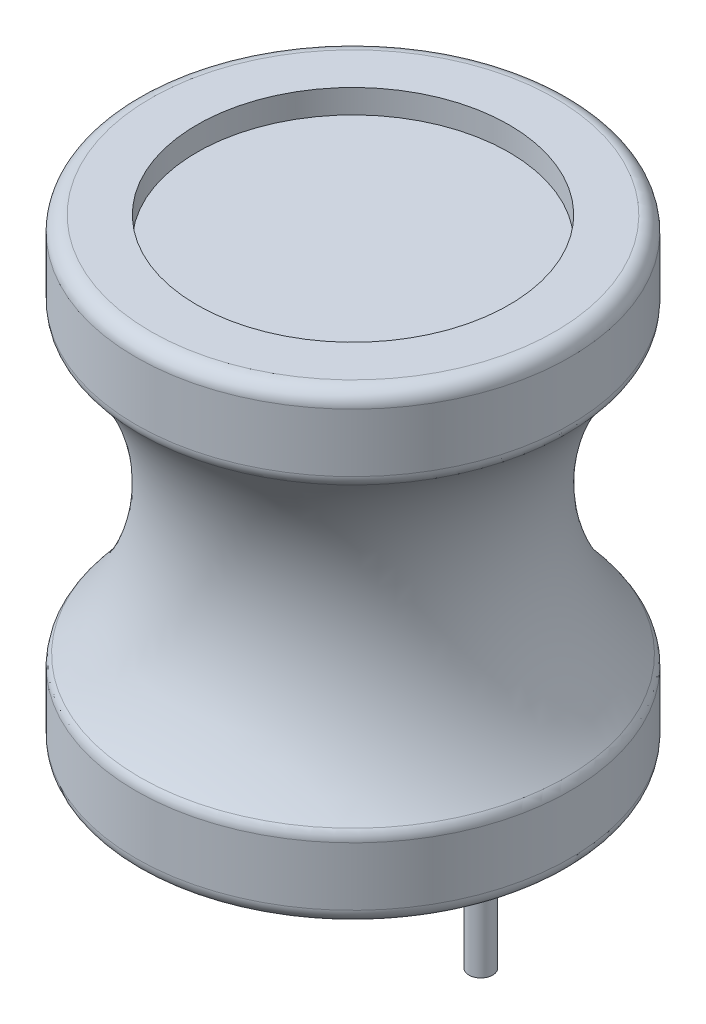
ISO-10303-21;
HEADER;
FILE_DESCRIPTION(('STEP AP214'),'2;1');
FILE_NAME('part.step','',(''),(''),'','','');
FILE_SCHEMA(('AUTOMOTIVE_DESIGN { 1 0 10303 214 1 1 1 1 }'));
ENDSEC;
DATA;
#1=APPLICATION_CONTEXT('core data for automotive mechanical design processes');
#2=APPLICATION_PROTOCOL_DEFINITION('international standard','automotive_design',2000,#1);
#3=PRODUCT_CONTEXT('',#1,'mechanical');
#4=PRODUCT('Part','Part','',(#3));
#5=PRODUCT_RELATED_PRODUCT_CATEGORY('part','',(#4));
#6=PRODUCT_DEFINITION_FORMATION('','',#4);
#7=PRODUCT_DEFINITION_CONTEXT('part definition',#1,'design');
#8=PRODUCT_DEFINITION('design','',#6,#7);
#9=PRODUCT_DEFINITION_SHAPE('','',#8);
#10=(LENGTH_UNIT() NAMED_UNIT(*) SI_UNIT(.MILLI.,.METRE.));
#11=(NAMED_UNIT(*) PLANE_ANGLE_UNIT() SI_UNIT($,.RADIAN.));
#12=(NAMED_UNIT(*) SI_UNIT($,.STERADIAN.) SOLID_ANGLE_UNIT());
#13=UNCERTAINTY_MEASURE_WITH_UNIT(LENGTH_MEASURE(1.E-05),#10,'distance_accuracy_value','');
#14=(GEOMETRIC_REPRESENTATION_CONTEXT(3) GLOBAL_UNCERTAINTY_ASSIGNED_CONTEXT((#13)) GLOBAL_UNIT_ASSIGNED_CONTEXT((#10,
#11,#12)) REPRESENTATION_CONTEXT('',''));
#15=CARTESIAN_POINT('',(0.,0.,0.));
#16=DIRECTION('',(0.,0.,1.));
#17=DIRECTION('',(1.,0.,0.));
#18=AXIS2_PLACEMENT_3D('',#15,#16,#17);
#19=CARTESIAN_POINT('',(0.,7.3,0.));
#20=DIRECTION('',(0.,1.,0.));
#21=DIRECTION('',(0.,0.,1.));
#22=AXIS2_PLACEMENT_3D('',#19,#20,#21);
#23=TOROIDAL_SURFACE('',#22,6.8,0.5);
#24=CARTESIAN_POINT('',(0.,7.3,0.));
#25=DIRECTION('',(0.,1.,0.));
#26=DIRECTION('',(0.,0.,1.));
#27=AXIS2_PLACEMENT_3D('',#24,#25,#26);
#28=CIRCLE('',#27,7.3);
#29=CARTESIAN_POINT('',(0.,7.3,7.3));
#30=VERTEX_POINT('',#29);
#31=EDGE_CURVE('E10',#30,#30,#28,.T.);
#32=ORIENTED_EDGE('',*,*,#31,.T.);
#33=EDGE_LOOP('',(#32));
#34=FACE_BOUND('',#33,.T.);
#35=CARTESIAN_POINT('',(0.,7.8,0.));
#36=DIRECTION('',(0.,1.,0.));
#37=DIRECTION('',(0.,0.,1.));
#38=AXIS2_PLACEMENT_3D('',#35,#36,#37);
#39=CIRCLE('',#38,6.8);
#40=CARTESIAN_POINT('',(0.,7.8,6.8));
#41=VERTEX_POINT('',#40);
#42=EDGE_CURVE('E89',#41,#41,#39,.T.);
#43=ORIENTED_EDGE('',*,*,#42,.F.);
#44=EDGE_LOOP('',(#43));
#45=FACE_BOUND('',#44,.T.);
#46=ADVANCED_FACE('F36',(#34,#45),#23,.T.);
#47=CARTESIAN_POINT('',(0.,12.5652577925041,0.));
#48=DIRECTION('',(0.,1.,0.));
#49=DIRECTION('',(0.,0.,1.));
#50=AXIS2_PLACEMENT_3D('',#47,#48,#49);
#51=CYLINDRICAL_SURFACE('',#50,7.3);
#52=CARTESIAN_POINT('',(0.,5.33482645950291,0.));
#53=DIRECTION('',(0.,1.,0.));
#54=DIRECTION('',(0.,0.,1.));
#55=AXIS2_PLACEMENT_3D('',#52,#53,#54);
#56=CIRCLE('',#55,7.3);
#57=CARTESIAN_POINT('',(0.,5.33482645950291,7.3));
#58=VERTEX_POINT('',#57);
#59=EDGE_CURVE('E43',#58,#58,#56,.T.);
#60=ORIENTED_EDGE('',*,*,#59,.T.);
#61=EDGE_LOOP('',(#60));
#62=FACE_BOUND('',#61,.T.);
#63=ORIENTED_EDGE('',*,*,#31,.F.);
#64=EDGE_LOOP('',(#63));
#65=FACE_BOUND('',#64,.T.);
#66=ADVANCED_FACE('F165',(#62,#65),#51,.T.);
#67=CARTESIAN_POINT('',(0.,5.33482645950291,0.));
#68=DIRECTION('',(0.,1.,0.));
#69=DIRECTION('',(0.,0.,1.));
#70=AXIS2_PLACEMENT_3D('',#67,#68,#69);
#71=TOROIDAL_SURFACE('',#70,6.8,0.5);
#72=CARTESIAN_POINT('',(0.,5.,0.));
#73=DIRECTION('',(0.,1.,0.));
#74=DIRECTION('',(0.,0.,1.));
#75=AXIS2_PLACEMENT_3D('',#72,#73,#74);
#76=CIRCLE('',#75,7.17133710024282);
#77=CARTESIAN_POINT('',(0.,5.,7.17133710024282));
#78=VERTEX_POINT('',#77);
#79=EDGE_CURVE('E50',#78,#78,#76,.T.);
#80=ORIENTED_EDGE('',*,*,#79,.T.);
#81=EDGE_LOOP('',(#80));
#82=FACE_BOUND('',#81,.T.);
#83=ORIENTED_EDGE('',*,*,#59,.F.);
#84=EDGE_LOOP('',(#83));
#85=FACE_BOUND('',#84,.T.);
#86=ADVANCED_FACE('F159',(#82,#85),#71,.T.);
#87=CARTESIAN_POINT('',(0.,0.,0.));
#88=DIRECTION('',(0.,1.,0.));
#89=DIRECTION('',(0.,0.,1.));
#90=AXIS2_PLACEMENT_3D('',#87,#88,#89);
#91=TOROIDAL_SURFACE('',#90,12.7165544763445,7.46655447634447);
#92=CARTESIAN_POINT('',(0.,-5.,0.));
#93=DIRECTION('',(0.,1.,0.));
#94=DIRECTION('',(0.,0.,1.));
#95=AXIS2_PLACEMENT_3D('',#92,#93,#94);
#96=CIRCLE('',#95,7.17133710024282);
#97=CARTESIAN_POINT('',(0.,-5.,7.17133710024282));
#98=VERTEX_POINT('',#97);
#99=EDGE_CURVE('E56',#98,#98,#96,.T.);
#100=ORIENTED_EDGE('',*,*,#99,.T.);
#101=EDGE_LOOP('',(#100));
#102=FACE_BOUND('',#101,.T.);
#103=ORIENTED_EDGE('',*,*,#79,.F.);
#104=EDGE_LOOP('',(#103));
#105=FACE_BOUND('',#104,.T.);
#106=ADVANCED_FACE('F153',(#102,#105),#91,.F.);
#107=CARTESIAN_POINT('',(0.,-5.33482645950291,0.));
#108=DIRECTION('',(0.,1.,0.));
#109=DIRECTION('',(0.,0.,1.));
#110=AXIS2_PLACEMENT_3D('',#107,#108,#109);
#111=TOROIDAL_SURFACE('',#110,6.8,0.5);
#112=CARTESIAN_POINT('',(0.,-5.33482645950291,0.));
#113=DIRECTION('',(0.,1.,0.));
#114=DIRECTION('',(0.,0.,1.));
#115=AXIS2_PLACEMENT_3D('',#112,#113,#114);
#116=CIRCLE('',#115,7.3);
#117=CARTESIAN_POINT('',(0.,-5.33482645950291,7.3));
#118=VERTEX_POINT('',#117);
#119=EDGE_CURVE('E62',#118,#118,#116,.T.);
#120=ORIENTED_EDGE('',*,*,#119,.T.);
#121=EDGE_LOOP('',(#120));
#122=FACE_BOUND('',#121,.T.);
#123=ORIENTED_EDGE('',*,*,#99,.F.);
#124=EDGE_LOOP('',(#123));
#125=FACE_BOUND('',#124,.T.);
#126=ADVANCED_FACE('F147',(#122,#125),#111,.T.);
#127=CARTESIAN_POINT('',(0.,12.5652577925041,0.));
#128=DIRECTION('',(0.,1.,0.));
#129=DIRECTION('',(0.,0.,1.));
#130=AXIS2_PLACEMENT_3D('',#127,#128,#129);
#131=CYLINDRICAL_SURFACE('',#130,7.3);
#132=CARTESIAN_POINT('',(0.,-7.3,0.));
#133=DIRECTION('',(0.,1.,0.));
#134=DIRECTION('',(0.,0.,1.));
#135=AXIS2_PLACEMENT_3D('',#132,#133,#134);
#136=CIRCLE('',#135,7.3);
#137=CARTESIAN_POINT('',(0.,-7.3,7.3));
#138=VERTEX_POINT('',#137);
#139=EDGE_CURVE('E66',#138,#138,#136,.T.);
#140=ORIENTED_EDGE('',*,*,#139,.T.);
#141=EDGE_LOOP('',(#140));
#142=FACE_BOUND('',#141,.T.);
#143=ORIENTED_EDGE('',*,*,#119,.F.);
#144=EDGE_LOOP('',(#143));
#145=FACE_BOUND('',#144,.T.);
#146=ADVANCED_FACE('F141',(#142,#145),#131,.T.);
#147=CARTESIAN_POINT('',(0.,-7.3,0.));
#148=DIRECTION('',(0.,1.,0.));
#149=DIRECTION('',(0.,0.,1.));
#150=AXIS2_PLACEMENT_3D('',#147,#148,#149);
#151=TOROIDAL_SURFACE('',#150,6.8,0.5);
#152=CARTESIAN_POINT('',(0.,-7.8,0.));
#153=DIRECTION('',(0.,1.,0.));
#154=DIRECTION('',(0.,0.,1.));
#155=AXIS2_PLACEMENT_3D('',#152,#153,#154);
#156=CIRCLE('',#155,6.8);
#157=CARTESIAN_POINT('',(0.,-7.8,6.8));
#158=VERTEX_POINT('',#157);
#159=EDGE_CURVE('E70',#158,#158,#156,.T.);
#160=ORIENTED_EDGE('',*,*,#159,.T.);
#161=EDGE_LOOP('',(#160));
#162=FACE_BOUND('',#161,.T.);
#163=ORIENTED_EDGE('',*,*,#139,.F.);
#164=EDGE_LOOP('',(#163));
#165=FACE_BOUND('',#164,.T.);
#166=ADVANCED_FACE('F135',(#162,#165),#151,.T.);
#167=CARTESIAN_POINT('',(0.,-7.8,6.8));
#168=DIRECTION('',(0.,-1.,0.));
#169=DIRECTION('',(0.,0.,-1.));
#170=AXIS2_PLACEMENT_3D('',#167,#168,#169);
#171=PLANE('',#170);
#172=CARTESIAN_POINT('',(0.,-7.8,0.));
#173=DIRECTION('',(0.,1.,0.));
#174=DIRECTION('',(0.,0.,1.));
#175=AXIS2_PLACEMENT_3D('',#172,#173,#174);
#176=CIRCLE('',#175,5.25);
#177=CARTESIAN_POINT('',(0.,-7.8,5.25));
#178=VERTEX_POINT('',#177);
#179=EDGE_CURVE('E74',#178,#178,#176,.T.);
#180=ORIENTED_EDGE('',*,*,#179,.T.);
#181=EDGE_LOOP('',(#180));
#182=FACE_BOUND('',#181,.T.);
#183=ORIENTED_EDGE('',*,*,#159,.F.);
#184=EDGE_LOOP('',(#183));
#185=FACE_BOUND('',#184,.T.);
#186=ADVANCED_FACE('F129',(#182,#185),#171,.T.);
#187=CARTESIAN_POINT('',(0.,12.5652577925041,0.));
#188=DIRECTION('',(0.,1.,0.));
#189=DIRECTION('',(0.,0.,1.));
#190=AXIS2_PLACEMENT_3D('',#187,#188,#189);
#191=CYLINDRICAL_SURFACE('',#190,5.25);
#192=CARTESIAN_POINT('',(0.,-7.,0.));
#193=DIRECTION('',(0.,1.,0.));
#194=DIRECTION('',(0.,0.,1.));
#195=AXIS2_PLACEMENT_3D('',#192,#193,#194);
#196=CIRCLE('',#195,5.25);
#197=CARTESIAN_POINT('',(0.,-7.,5.25));
#198=VERTEX_POINT('',#197);
#199=EDGE_CURVE('E78',#198,#198,#196,.T.);
#200=ORIENTED_EDGE('',*,*,#199,.T.);
#201=EDGE_LOOP('',(#200));
#202=FACE_BOUND('',#201,.T.);
#203=ORIENTED_EDGE('',*,*,#179,.F.);
#204=EDGE_LOOP('',(#203));
#205=FACE_BOUND('',#204,.T.);
#206=ADVANCED_FACE('F121',(#202,#205),#191,.F.);
#207=CARTESIAN_POINT('',(0.,-7.,5.25));
#208=DIRECTION('',(0.,-1.,0.));
#209=DIRECTION('',(0.,0.,-1.));
#210=AXIS2_PLACEMENT_3D('',#207,#208,#209);
#211=PLANE('',#210);
#212=CARTESIAN_POINT('',(4.3,-7.,0.));
#213=DIRECTION('',(0.,-1.,0.));
#214=DIRECTION('',(0.,0.,1.));
#215=AXIS2_PLACEMENT_3D('',#212,#213,#214);
#216=CIRCLE('',#215,0.4);
#217=CARTESIAN_POINT('',(4.3,-7.,0.400000000000002));
#218=VERTEX_POINT('',#217);
#219=EDGE_CURVE('E101',#218,#218,#216,.T.);
#220=ORIENTED_EDGE('',*,*,#219,.F.);
#221=EDGE_LOOP('',(#220));
#222=FACE_BOUND('',#221,.T.);
#223=CARTESIAN_POINT('',(-4.3,-7.,0.));
#224=DIRECTION('',(0.,-1.,0.));
#225=DIRECTION('',(0.,0.,-1.));
#226=AXIS2_PLACEMENT_3D('',#223,#224,#225);
#227=CIRCLE('',#226,0.4);
#228=CARTESIAN_POINT('',(-4.3,-7.,-0.4));
#229=VERTEX_POINT('',#228);
#230=EDGE_CURVE('E93',#229,#229,#227,.T.);
#231=ORIENTED_EDGE('',*,*,#230,.F.);
#232=EDGE_LOOP('',(#231));
#233=FACE_BOUND('',#232,.T.);
#234=ORIENTED_EDGE('',*,*,#199,.F.);
#235=EDGE_LOOP('',(#234));
#236=FACE_BOUND('',#235,.T.);
#237=ADVANCED_FACE('F117',(#222,#233,#236),#211,.T.);
#238=CARTESIAN_POINT('',(0.,7.,5.25));
#239=DIRECTION('',(0.,1.,0.));
#240=DIRECTION('',(0.,0.,1.));
#241=AXIS2_PLACEMENT_3D('',#238,#239,#240);
#242=PLANE('',#241);
#243=CARTESIAN_POINT('',(0.,7.,0.));
#244=DIRECTION('',(0.,1.,0.));
#245=DIRECTION('',(0.,0.,1.));
#246=AXIS2_PLACEMENT_3D('',#243,#244,#245);
#247=CIRCLE('',#246,5.25);
#248=CARTESIAN_POINT('',(0.,7.,5.25));
#249=VERTEX_POINT('',#248);
#250=EDGE_CURVE('E82',#249,#249,#247,.T.);
#251=ORIENTED_EDGE('',*,*,#250,.T.);
#252=EDGE_LOOP('',(#251));
#253=FACE_BOUND('',#252,.T.);
#254=ADVANCED_FACE('F120',(#253),#242,.T.);
#255=CARTESIAN_POINT('',(0.,12.5652577925041,0.));
#256=DIRECTION('',(0.,1.,0.));
#257=DIRECTION('',(0.,0.,1.));
#258=AXIS2_PLACEMENT_3D('',#255,#256,#257);
#259=CYLINDRICAL_SURFACE('',#258,5.25);
#260=CARTESIAN_POINT('',(0.,7.8,0.));
#261=DIRECTION('',(0.,1.,0.));
#262=DIRECTION('',(0.,0.,1.));
#263=AXIS2_PLACEMENT_3D('',#260,#261,#262);
#264=CIRCLE('',#263,5.25);
#265=CARTESIAN_POINT('',(0.,7.8,5.25));
#266=VERTEX_POINT('',#265);
#267=EDGE_CURVE('E85',#266,#266,#264,.T.);
#268=ORIENTED_EDGE('',*,*,#267,.T.);
#269=EDGE_LOOP('',(#268));
#270=FACE_BOUND('',#269,.T.);
#271=ORIENTED_EDGE('',*,*,#250,.F.);
#272=EDGE_LOOP('',(#271));
#273=FACE_BOUND('',#272,.T.);
#274=ADVANCED_FACE('F180',(#270,#273),#259,.F.);
#275=CARTESIAN_POINT('',(0.,7.8,6.8));
#276=DIRECTION('',(0.,1.,0.));
#277=DIRECTION('',(0.,0.,1.));
#278=AXIS2_PLACEMENT_3D('',#275,#276,#277);
#279=PLANE('',#278);
#280=ORIENTED_EDGE('',*,*,#42,.T.);
#281=EDGE_LOOP('',(#280));
#282=FACE_BOUND('',#281,.T.);
#283=ORIENTED_EDGE('',*,*,#267,.F.);
#284=EDGE_LOOP('',(#283));
#285=FACE_BOUND('',#284,.T.);
#286=ADVANCED_FACE('F176',(#282,#285),#279,.T.);
#287=CARTESIAN_POINT('',(-4.3,-12.,0.));
#288=DIRECTION('',(0.,1.,0.));
#289=DIRECTION('',(0.,0.,1.));
#290=AXIS2_PLACEMENT_3D('',#287,#288,#289);
#291=CYLINDRICAL_SURFACE('',#290,0.4);
#292=CARTESIAN_POINT('',(-4.3,-12.,0.));
#293=DIRECTION('',(0.,-1.,0.));
#294=DIRECTION('',(0.,0.,-1.));
#295=AXIS2_PLACEMENT_3D('',#292,#293,#294);
#296=CIRCLE('',#295,0.4);
#297=CARTESIAN_POINT('',(-4.3,-12.,-0.4));
#298=VERTEX_POINT('',#297);
#299=EDGE_CURVE('E92',#298,#298,#296,.T.);
#300=ORIENTED_EDGE('',*,*,#299,.F.);
#301=EDGE_LOOP('',(#300));
#302=FACE_BOUND('',#301,.T.);
#303=ORIENTED_EDGE('',*,*,#230,.T.);
#304=EDGE_LOOP('',(#303));
#305=FACE_BOUND('',#304,.T.);
#306=ADVANCED_FACE('F179',(#302,#305),#291,.T.);
#307=CARTESIAN_POINT('',(-4.3,-12.,0.));
#308=DIRECTION('',(0.,-1.,0.));
#309=DIRECTION('',(0.,0.,-1.));
#310=AXIS2_PLACEMENT_3D('',#307,#308,#309);
#311=PLANE('',#310);
#312=ORIENTED_EDGE('',*,*,#299,.T.);
#313=EDGE_LOOP('',(#312));
#314=FACE_BOUND('',#313,.T.);
#315=ADVANCED_FACE('F113',(#314),#311,.T.);
#316=CARTESIAN_POINT('',(4.3,-12.,0.));
#317=DIRECTION('',(0.,1.,0.));
#318=DIRECTION('',(0.,0.,1.));
#319=AXIS2_PLACEMENT_3D('',#316,#317,#318);
#320=CYLINDRICAL_SURFACE('',#319,0.4);
#321=CARTESIAN_POINT('',(4.3,-12.,0.));
#322=DIRECTION('',(0.,-1.,0.));
#323=DIRECTION('',(0.,0.,1.));
#324=AXIS2_PLACEMENT_3D('',#321,#322,#323);
#325=CIRCLE('',#324,0.4);
#326=CARTESIAN_POINT('',(4.3,-12.,0.400000000000002));
#327=VERTEX_POINT('',#326);
#328=EDGE_CURVE('E97',#327,#327,#325,.T.);
#329=ORIENTED_EDGE('',*,*,#328,.F.);
#330=EDGE_LOOP('',(#329));
#331=FACE_BOUND('',#330,.T.);
#332=ORIENTED_EDGE('',*,*,#219,.T.);
#333=EDGE_LOOP('',(#332));
#334=FACE_BOUND('',#333,.T.);
#335=ADVANCED_FACE('F110',(#331,#334),#320,.T.);
#336=CARTESIAN_POINT('',(4.3,-12.,0.));
#337=DIRECTION('',(0.,1.,0.));
#338=DIRECTION('',(0.,0.,1.));
#339=AXIS2_PLACEMENT_3D('',#336,#337,#338);
#340=PLANE('',#339);
#341=ORIENTED_EDGE('',*,*,#328,.T.);
#342=EDGE_LOOP('',(#341));
#343=FACE_BOUND('',#342,.T.);
#344=ADVANCED_FACE('F108',(#343),#340,.F.);
#345=CLOSED_SHELL('',(#46,#66,#86,#106,#126,#146,#166,#186,#206,#237,#254,#274,#286,#306,#315,
#335,#344));
#346=MANIFOLD_SOLID_BREP('B2',#345);
#347=ADVANCED_BREP_SHAPE_REPRESENTATION('',(#18,#346),#14);
#348=SHAPE_DEFINITION_REPRESENTATION(#9,#347);
ENDSEC;
END-ISO-10303-21;
